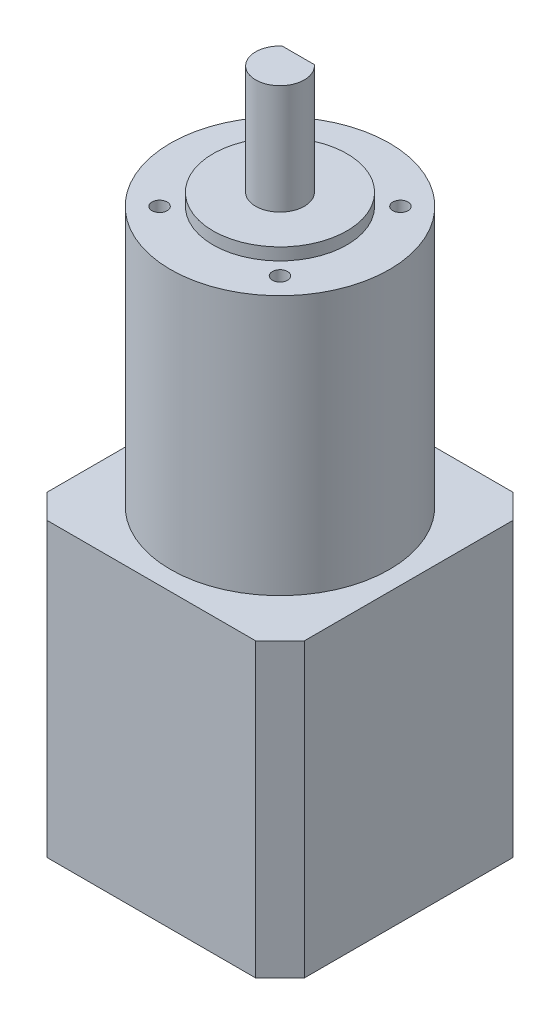
ISO-10303-21;
HEADER;
FILE_DESCRIPTION(('STEP AP214'),'2;1');
FILE_NAME('part.step','',(''),(''),'','','');
FILE_SCHEMA(('AUTOMOTIVE_DESIGN { 1 0 10303 214 1 1 1 1 }'));
ENDSEC;
DATA;
#1=APPLICATION_CONTEXT('core data for automotive mechanical design processes');
#2=APPLICATION_PROTOCOL_DEFINITION('international standard','automotive_design',2000,#1);
#3=PRODUCT_CONTEXT('',#1,'mechanical');
#4=PRODUCT('Part','Part','',(#3));
#5=PRODUCT_RELATED_PRODUCT_CATEGORY('part','',(#4));
#6=PRODUCT_DEFINITION_FORMATION('','',#4);
#7=PRODUCT_DEFINITION_CONTEXT('part definition',#1,'design');
#8=PRODUCT_DEFINITION('design','',#6,#7);
#9=PRODUCT_DEFINITION_SHAPE('','',#8);
#10=(LENGTH_UNIT() NAMED_UNIT(*) SI_UNIT(.MILLI.,.METRE.));
#11=(NAMED_UNIT(*) PLANE_ANGLE_UNIT() SI_UNIT($,.RADIAN.));
#12=(NAMED_UNIT(*) SI_UNIT($,.STERADIAN.) SOLID_ANGLE_UNIT());
#13=UNCERTAINTY_MEASURE_WITH_UNIT(LENGTH_MEASURE(1.E-05),#10,'distance_accuracy_value','');
#14=(GEOMETRIC_REPRESENTATION_CONTEXT(3) GLOBAL_UNCERTAINTY_ASSIGNED_CONTEXT((#13)) GLOBAL_UNIT_ASSIGNED_CONTEXT((#10,
#11,#12)) REPRESENTATION_CONTEXT('',''));
#15=CARTESIAN_POINT('',(0.,0.,0.));
#16=DIRECTION('',(0.,0.,1.));
#17=DIRECTION('',(1.,0.,0.));
#18=AXIS2_PLACEMENT_3D('',#15,#16,#17);
#19=CARTESIAN_POINT('',(-21.15,-48.,-21.15));
#20=DIRECTION('',(-1.,0.,0.));
#21=DIRECTION('',(0.,0.,1.));
#22=AXIS2_PLACEMENT_3D('',#19,#20,#21);
#23=PLANE('',#22);
#24=DIRECTION('',(0.,0.,1.));
#25=VECTOR('',#24,1.);
#26=CARTESIAN_POINT('',(-21.15,0.,-21.15));
#27=LINE('',#26,#25);
#28=CARTESIAN_POINT('',(-21.15,0.,-17.15));
#29=VERTEX_POINT('',#28);
#30=CARTESIAN_POINT('',(-21.15,0.,17.15));
#31=VERTEX_POINT('',#30);
#32=EDGE_CURVE('E208',#29,#31,#27,.T.);
#33=ORIENTED_EDGE('',*,*,#32,.F.);
#34=DIRECTION('',(0.,-1.,0.));
#35=VECTOR('',#34,1.);
#36=CARTESIAN_POINT('',(-21.15,-48.,-17.15));
#37=LINE('',#36,#35);
#38=CARTESIAN_POINT('',(-21.15,-48.,-17.15));
#39=VERTEX_POINT('',#38);
#40=EDGE_CURVE('E284',#29,#39,#37,.T.);
#41=ORIENTED_EDGE('',*,*,#40,.T.);
#42=DIRECTION('',(0.,0.,1.));
#43=VECTOR('',#42,1.);
#44=CARTESIAN_POINT('',(-21.15,-48.,-21.15));
#45=LINE('',#44,#43);
#46=CARTESIAN_POINT('',(-21.15,-48.,17.15));
#47=VERTEX_POINT('',#46);
#48=EDGE_CURVE('E213',#39,#47,#45,.T.);
#49=ORIENTED_EDGE('',*,*,#48,.T.);
#50=DIRECTION('',(0.,1.,0.));
#51=VECTOR('',#50,1.);
#52=CARTESIAN_POINT('',(-21.15,-48.,17.15));
#53=LINE('',#52,#51);
#54=EDGE_CURVE('E280',#47,#31,#53,.T.);
#55=ORIENTED_EDGE('',*,*,#54,.T.);
#56=EDGE_LOOP('',(#33,#41,#49,#55));
#57=FACE_BOUND('',#56,.T.);
#58=ADVANCED_FACE('F43',(#57),#23,.T.);
#59=CARTESIAN_POINT('',(-21.15,-48.,-21.15));
#60=DIRECTION('',(0.,0.,-1.));
#61=DIRECTION('',(-1.,0.,0.));
#62=AXIS2_PLACEMENT_3D('',#59,#60,#61);
#63=PLANE('',#62);
#64=DIRECTION('',(-1.,0.,0.));
#65=VECTOR('',#64,1.);
#66=CARTESIAN_POINT('',(-21.15,0.,-21.15));
#67=LINE('',#66,#65);
#68=CARTESIAN_POINT('',(17.15,0.,-21.15));
#69=VERTEX_POINT('',#68);
#70=CARTESIAN_POINT('',(-17.15,0.,-21.15));
#71=VERTEX_POINT('',#70);
#72=EDGE_CURVE('E218',#69,#71,#67,.T.);
#73=ORIENTED_EDGE('',*,*,#72,.F.);
#74=DIRECTION('',(0.,-1.,0.));
#75=VECTOR('',#74,1.);
#76=CARTESIAN_POINT('',(17.15,-48.,-21.15));
#77=LINE('',#76,#75);
#78=CARTESIAN_POINT('',(17.15,-48.,-21.15));
#79=VERTEX_POINT('',#78);
#80=EDGE_CURVE('E266',#69,#79,#77,.T.);
#81=ORIENTED_EDGE('',*,*,#80,.T.);
#82=DIRECTION('',(-1.,0.,0.));
#83=VECTOR('',#82,1.);
#84=CARTESIAN_POINT('',(-21.15,-48.,-21.15));
#85=LINE('',#84,#83);
#86=CARTESIAN_POINT('',(-17.15,-48.,-21.15));
#87=VERTEX_POINT('',#86);
#88=EDGE_CURVE('E225',#79,#87,#85,.T.);
#89=ORIENTED_EDGE('',*,*,#88,.T.);
#90=DIRECTION('',(0.,1.,0.));
#91=VECTOR('',#90,1.);
#92=CARTESIAN_POINT('',(-17.15,-48.,-21.15));
#93=LINE('',#92,#91);
#94=EDGE_CURVE('E262',#87,#71,#93,.T.);
#95=ORIENTED_EDGE('',*,*,#94,.T.);
#96=EDGE_LOOP('',(#73,#81,#89,#95));
#97=FACE_BOUND('',#96,.T.);
#98=ADVANCED_FACE('F314',(#97),#63,.T.);
#99=CARTESIAN_POINT('',(21.15,-48.,-21.15));
#100=DIRECTION('',(1.,0.,0.));
#101=DIRECTION('',(0.,0.,-1.));
#102=AXIS2_PLACEMENT_3D('',#99,#100,#101);
#103=PLANE('',#102);
#104=DIRECTION('',(0.,0.,-1.));
#105=VECTOR('',#104,1.);
#106=CARTESIAN_POINT('',(21.15,-48.,-21.15));
#107=LINE('',#106,#105);
#108=CARTESIAN_POINT('',(21.15,-48.,17.15));
#109=VERTEX_POINT('',#108);
#110=CARTESIAN_POINT('',(21.15,-48.,-17.15));
#111=VERTEX_POINT('',#110);
#112=EDGE_CURVE('E221',#109,#111,#107,.T.);
#113=ORIENTED_EDGE('',*,*,#112,.T.);
#114=DIRECTION('',(0.,1.,0.));
#115=VECTOR('',#114,1.);
#116=CARTESIAN_POINT('',(21.15,-48.,-17.15));
#117=LINE('',#116,#115);
#118=CARTESIAN_POINT('',(21.15,0.,-17.15));
#119=VERTEX_POINT('',#118);
#120=EDGE_CURVE('E246',#111,#119,#117,.T.);
#121=ORIENTED_EDGE('',*,*,#120,.T.);
#122=DIRECTION('',(0.,0.,-1.));
#123=VECTOR('',#122,1.);
#124=CARTESIAN_POINT('',(21.15,0.,-21.15));
#125=LINE('',#124,#123);
#126=CARTESIAN_POINT('',(21.15,0.,17.15));
#127=VERTEX_POINT('',#126);
#128=EDGE_CURVE('E237',#127,#119,#125,.T.);
#129=ORIENTED_EDGE('',*,*,#128,.F.);
#130=DIRECTION('',(0.,-1.,0.));
#131=VECTOR('',#130,1.);
#132=CARTESIAN_POINT('',(21.15,-48.,17.15));
#133=LINE('',#132,#131);
#134=EDGE_CURVE('E229',#127,#109,#133,.T.);
#135=ORIENTED_EDGE('',*,*,#134,.T.);
#136=EDGE_LOOP('',(#113,#121,#129,#135));
#137=FACE_BOUND('',#136,.T.);
#138=ADVANCED_FACE('F322',(#137),#103,.T.);
#139=CARTESIAN_POINT('',(-21.15,-48.,21.15));
#140=DIRECTION('',(0.,0.,1.));
#141=DIRECTION('',(1.,0.,0.));
#142=AXIS2_PLACEMENT_3D('',#139,#140,#141);
#143=PLANE('',#142);
#144=DIRECTION('',(1.,0.,0.));
#145=VECTOR('',#144,1.);
#146=CARTESIAN_POINT('',(-21.15,0.,21.15));
#147=LINE('',#146,#145);
#148=CARTESIAN_POINT('',(-17.15,0.,21.15));
#149=VERTEX_POINT('',#148);
#150=CARTESIAN_POINT('',(17.15,0.,21.15));
#151=VERTEX_POINT('',#150);
#152=EDGE_CURVE('E233',#149,#151,#147,.T.);
#153=ORIENTED_EDGE('',*,*,#152,.F.);
#154=DIRECTION('',(0.,-1.,0.));
#155=VECTOR('',#154,1.);
#156=CARTESIAN_POINT('',(-17.15,-48.,21.15));
#157=LINE('',#156,#155);
#158=CARTESIAN_POINT('',(-17.15,-48.,21.15));
#159=VERTEX_POINT('',#158);
#160=EDGE_CURVE('E212',#149,#159,#157,.T.);
#161=ORIENTED_EDGE('',*,*,#160,.T.);
#162=DIRECTION('',(1.,0.,0.));
#163=VECTOR('',#162,1.);
#164=CARTESIAN_POINT('',(-21.15,-48.,21.15));
#165=LINE('',#164,#163);
#166=CARTESIAN_POINT('',(17.15,-48.,21.15));
#167=VERTEX_POINT('',#166);
#168=EDGE_CURVE('E217',#159,#167,#165,.T.);
#169=ORIENTED_EDGE('',*,*,#168,.T.);
#170=DIRECTION('',(0.,1.,0.));
#171=VECTOR('',#170,1.);
#172=CARTESIAN_POINT('',(17.15,-48.,21.15));
#173=LINE('',#172,#171);
#174=EDGE_CURVE('E287',#167,#151,#173,.T.);
#175=ORIENTED_EDGE('',*,*,#174,.T.);
#176=EDGE_LOOP('',(#153,#161,#169,#175));
#177=FACE_BOUND('',#176,.T.);
#178=ADVANCED_FACE('F294',(#177),#143,.T.);
#179=CARTESIAN_POINT('',(0.,-48.,0.));
#180=DIRECTION('',(0.,1.,0.));
#181=DIRECTION('',(0.,0.,1.));
#182=AXIS2_PLACEMENT_3D('',#179,#180,#181);
#183=PLANE('',#182);
#184=ORIENTED_EDGE('',*,*,#88,.F.);
#185=DIRECTION('',(-0.707106781186549,0.,-0.707106781186546));
#186=VECTOR('',#185,1.);
#187=CARTESIAN_POINT('',(21.15,-48.,-17.15));
#188=LINE('',#187,#186);
#189=EDGE_CURVE('E277',#79,#111,#188,.F.);
#190=ORIENTED_EDGE('',*,*,#189,.T.);
#191=ORIENTED_EDGE('',*,*,#112,.F.);
#192=DIRECTION('',(0.707106781186546,0.,-0.707106781186549));
#193=VECTOR('',#192,1.);
#194=CARTESIAN_POINT('',(17.15,-48.,21.15));
#195=LINE('',#194,#193);
#196=EDGE_CURVE('E68',#109,#167,#195,.F.);
#197=ORIENTED_EDGE('',*,*,#196,.T.);
#198=ORIENTED_EDGE('',*,*,#168,.F.);
#199=DIRECTION('',(0.707106781186549,0.,0.707106781186546));
#200=VECTOR('',#199,1.);
#201=CARTESIAN_POINT('',(-21.15,-48.,17.15));
#202=LINE('',#201,#200);
#203=EDGE_CURVE('E271',#159,#47,#202,.F.);
#204=ORIENTED_EDGE('',*,*,#203,.T.);
#205=ORIENTED_EDGE('',*,*,#48,.F.);
#206=DIRECTION('',(-0.707106781186546,0.,0.707106781186549));
#207=VECTOR('',#206,1.);
#208=CARTESIAN_POINT('',(-17.15,-48.,-21.15));
#209=LINE('',#208,#207);
#210=EDGE_CURVE('E274',#39,#87,#209,.F.);
#211=ORIENTED_EDGE('',*,*,#210,.T.);
#212=EDGE_LOOP('',(#184,#190,#191,#197,#198,#204,#205,#211));
#213=FACE_BOUND('',#212,.T.);
#214=ADVANCED_FACE('F299',(#213),#183,.F.);
#215=CARTESIAN_POINT('',(0.,0.,0.));
#216=DIRECTION('',(0.,1.,0.));
#217=DIRECTION('',(0.,0.,1.));
#218=AXIS2_PLACEMENT_3D('',#215,#216,#217);
#219=PLANE('',#218);
#220=CARTESIAN_POINT('',(0.,0.,0.));
#221=DIRECTION('',(0.,1.,0.));
#222=DIRECTION('',(0.,0.,1.));
#223=AXIS2_PLACEMENT_3D('',#220,#221,#222);
#224=CIRCLE('',#223,18.);
#225=CARTESIAN_POINT('',(0.,0.,-18.));
#226=VERTEX_POINT('',#225);
#227=EDGE_CURVE('E204',#226,#226,#224,.T.);
#228=ORIENTED_EDGE('',*,*,#227,.F.);
#229=EDGE_LOOP('',(#228));
#230=FACE_BOUND('',#229,.T.);
#231=ORIENTED_EDGE('',*,*,#128,.T.);
#232=DIRECTION('',(0.707106781186549,0.,0.707106781186546));
#233=VECTOR('',#232,1.);
#234=CARTESIAN_POINT('',(19.15,0.,-19.15));
#235=LINE('',#234,#233);
#236=EDGE_CURVE('E259',#119,#69,#235,.F.);
#237=ORIENTED_EDGE('',*,*,#236,.T.);
#238=ORIENTED_EDGE('',*,*,#72,.T.);
#239=DIRECTION('',(0.707106781186546,0.,-0.707106781186549));
#240=VECTOR('',#239,1.);
#241=CARTESIAN_POINT('',(-19.15,0.,-19.15));
#242=LINE('',#241,#240);
#243=EDGE_CURVE('E256',#71,#29,#242,.F.);
#244=ORIENTED_EDGE('',*,*,#243,.T.);
#245=ORIENTED_EDGE('',*,*,#32,.T.);
#246=DIRECTION('',(-0.707106781186549,0.,-0.707106781186546));
#247=VECTOR('',#246,1.);
#248=CARTESIAN_POINT('',(-19.15,0.,19.15));
#249=LINE('',#248,#247);
#250=EDGE_CURVE('E253',#31,#149,#249,.F.);
#251=ORIENTED_EDGE('',*,*,#250,.T.);
#252=ORIENTED_EDGE('',*,*,#152,.T.);
#253=DIRECTION('',(-0.707106781186546,0.,0.707106781186549));
#254=VECTOR('',#253,1.);
#255=CARTESIAN_POINT('',(19.15,0.,19.15));
#256=LINE('',#255,#254);
#257=EDGE_CURVE('E250',#151,#127,#256,.F.);
#258=ORIENTED_EDGE('',*,*,#257,.T.);
#259=EDGE_LOOP('',(#231,#237,#238,#244,#245,#251,#252,#258));
#260=FACE_BOUND('',#259,.T.);
#261=ADVANCED_FACE('F307',(#230,#260),#219,.T.);
#262=CARTESIAN_POINT('',(21.15,-48.,-17.15));
#263=DIRECTION('',(-0.707106781186546,0.,0.707106781186549));
#264=DIRECTION('',(0.,1.,0.));
#265=AXIS2_PLACEMENT_3D('',#262,#263,#264);
#266=PLANE('',#265);
#267=ORIENTED_EDGE('',*,*,#189,.F.);
#268=ORIENTED_EDGE('',*,*,#80,.F.);
#269=ORIENTED_EDGE('',*,*,#236,.F.);
#270=ORIENTED_EDGE('',*,*,#120,.F.);
#271=EDGE_LOOP('',(#267,#268,#269,#270));
#272=FACE_BOUND('',#271,.T.);
#273=ADVANCED_FACE('F319',(#272),#266,.F.);
#274=CARTESIAN_POINT('',(-17.15,-48.,-21.15));
#275=DIRECTION('',(0.707106781186549,0.,0.707106781186546));
#276=DIRECTION('',(0.,1.,0.));
#277=AXIS2_PLACEMENT_3D('',#274,#275,#276);
#278=PLANE('',#277);
#279=ORIENTED_EDGE('',*,*,#210,.F.);
#280=ORIENTED_EDGE('',*,*,#40,.F.);
#281=ORIENTED_EDGE('',*,*,#243,.F.);
#282=ORIENTED_EDGE('',*,*,#94,.F.);
#283=EDGE_LOOP('',(#279,#280,#281,#282));
#284=FACE_BOUND('',#283,.T.);
#285=ADVANCED_FACE('F312',(#284),#278,.F.);
#286=CARTESIAN_POINT('',(-21.15,-48.,17.15));
#287=DIRECTION('',(0.707106781186546,0.,-0.707106781186549));
#288=DIRECTION('',(0.,1.,0.));
#289=AXIS2_PLACEMENT_3D('',#286,#287,#288);
#290=PLANE('',#289);
#291=ORIENTED_EDGE('',*,*,#203,.F.);
#292=ORIENTED_EDGE('',*,*,#160,.F.);
#293=ORIENTED_EDGE('',*,*,#250,.F.);
#294=ORIENTED_EDGE('',*,*,#54,.F.);
#295=EDGE_LOOP('',(#291,#292,#293,#294));
#296=FACE_BOUND('',#295,.T.);
#297=ADVANCED_FACE('F302',(#296),#290,.F.);
#298=CARTESIAN_POINT('',(17.15,-48.,21.15));
#299=DIRECTION('',(-0.707106781186549,0.,-0.707106781186546));
#300=DIRECTION('',(0.,1.,0.));
#301=AXIS2_PLACEMENT_3D('',#298,#299,#300);
#302=PLANE('',#301);
#303=ORIENTED_EDGE('',*,*,#196,.F.);
#304=ORIENTED_EDGE('',*,*,#134,.F.);
#305=ORIENTED_EDGE('',*,*,#257,.F.);
#306=ORIENTED_EDGE('',*,*,#174,.F.);
#307=EDGE_LOOP('',(#303,#304,#305,#306));
#308=FACE_BOUND('',#307,.T.);
#309=ADVANCED_FACE('F46',(#308),#302,.F.);
#310=CARTESIAN_POINT('',(0.,42.7,0.));
#311=DIRECTION('',(0.,-1.,0.));
#312=DIRECTION('',(0.,0.,-1.));
#313=AXIS2_PLACEMENT_3D('',#310,#311,#312);
#314=CYLINDRICAL_SURFACE('',#313,18.);
#315=CARTESIAN_POINT('',(0.,42.7,0.));
#316=DIRECTION('',(0.,1.,0.));
#317=DIRECTION('',(0.,0.,1.));
#318=AXIS2_PLACEMENT_3D('',#315,#316,#317);
#319=CIRCLE('',#318,18.);
#320=CARTESIAN_POINT('',(0.,42.7,-18.));
#321=VERTEX_POINT('',#320);
#322=EDGE_CURVE('E200',#321,#321,#319,.T.);
#323=CARTESIAN_POINT('',(0.,42.7,-18.));
#324=CARTESIAN_POINT('',(0.,42.2552083333333,-18.));
#325=CARTESIAN_POINT('',(0.,41.8104166666667,-18.));
#326=CARTESIAN_POINT('',(0.,40.9208333333333,-18.));
#327=CARTESIAN_POINT('',(0.,40.4760416666667,-18.));
#328=CARTESIAN_POINT('',(0.,39.5864583333333,-18.));
#329=CARTESIAN_POINT('',(0.,39.1416666666667,-18.));
#330=CARTESIAN_POINT('',(0.,38.2520833333333,-18.));
#331=CARTESIAN_POINT('',(0.,37.8072916666667,-18.));
#332=CARTESIAN_POINT('',(0.,36.9177083333333,-18.));
#333=CARTESIAN_POINT('',(0.,36.4729166666667,-18.));
#334=CARTESIAN_POINT('',(0.,35.5833333333333,-18.));
#335=CARTESIAN_POINT('',(0.,35.1385416666667,-18.));
#336=CARTESIAN_POINT('',(0.,34.2489583333333,-18.));
#337=CARTESIAN_POINT('',(0.,33.8041666666667,-18.));
#338=CARTESIAN_POINT('',(0.,32.9145833333333,-18.));
#339=CARTESIAN_POINT('',(0.,32.4697916666667,-18.));
#340=CARTESIAN_POINT('',(0.,31.5802083333333,-18.));
#341=CARTESIAN_POINT('',(0.,31.1354166666667,-18.));
#342=CARTESIAN_POINT('',(0.,30.2458333333333,-18.));
#343=CARTESIAN_POINT('',(0.,29.8010416666667,-18.));
#344=CARTESIAN_POINT('',(0.,28.9114583333333,-18.));
#345=CARTESIAN_POINT('',(0.,28.4666666666667,-18.));
#346=CARTESIAN_POINT('',(0.,27.5770833333333,-18.));
#347=CARTESIAN_POINT('',(0.,27.1322916666667,-18.));
#348=CARTESIAN_POINT('',(0.,26.2427083333333,-18.));
#349=CARTESIAN_POINT('',(0.,25.7979166666667,-18.));
#350=CARTESIAN_POINT('',(0.,24.9083333333333,-18.));
#351=CARTESIAN_POINT('',(0.,24.4635416666667,-18.));
#352=CARTESIAN_POINT('',(0.,23.5739583333333,-18.));
#353=CARTESIAN_POINT('',(0.,23.1291666666667,-18.));
#354=CARTESIAN_POINT('',(0.,22.2395833333333,-18.));
#355=CARTESIAN_POINT('',(0.,21.7947916666667,-18.));
#356=CARTESIAN_POINT('',(0.,20.9052083333333,-18.));
#357=CARTESIAN_POINT('',(0.,20.4604166666667,-18.));
#358=CARTESIAN_POINT('',(0.,19.5708333333333,-18.));
#359=CARTESIAN_POINT('',(0.,19.1260416666667,-18.));
#360=CARTESIAN_POINT('',(0.,18.2364583333333,-18.));
#361=CARTESIAN_POINT('',(0.,17.7916666666667,-18.));
#362=CARTESIAN_POINT('',(0.,16.9020833333333,-18.));
#363=CARTESIAN_POINT('',(0.,16.4572916666667,-18.));
#364=CARTESIAN_POINT('',(0.,15.5677083333333,-18.));
#365=CARTESIAN_POINT('',(0.,15.1229166666667,-18.));
#366=CARTESIAN_POINT('',(0.,14.2333333333333,-18.));
#367=CARTESIAN_POINT('',(0.,13.7885416666667,-18.));
#368=CARTESIAN_POINT('',(0.,12.8989583333333,-18.));
#369=CARTESIAN_POINT('',(0.,12.4541666666667,-18.));
#370=CARTESIAN_POINT('',(0.,11.5645833333333,-18.));
#371=CARTESIAN_POINT('',(0.,11.1197916666667,-18.));
#372=CARTESIAN_POINT('',(0.,10.2302083333333,-18.));
#373=CARTESIAN_POINT('',(0.,9.78541666666666,-18.));
#374=CARTESIAN_POINT('',(0.,8.89583333333333,-18.));
#375=CARTESIAN_POINT('',(0.,8.45104166666667,-18.));
#376=CARTESIAN_POINT('',(0.,7.56145833333333,-18.));
#377=CARTESIAN_POINT('',(0.,7.11666666666666,-18.));
#378=CARTESIAN_POINT('',(0.,6.22708333333333,-18.));
#379=CARTESIAN_POINT('',(0.,5.78229166666666,-18.));
#380=CARTESIAN_POINT('',(0.,4.89270833333333,-18.));
#381=CARTESIAN_POINT('',(0.,4.44791666666666,-18.));
#382=CARTESIAN_POINT('',(0.,3.55833333333333,-18.));
#383=CARTESIAN_POINT('',(0.,3.11354166666666,-18.));
#384=CARTESIAN_POINT('',(0.,2.22395833333332,-18.));
#385=CARTESIAN_POINT('',(0.,1.77916666666666,-18.));
#386=CARTESIAN_POINT('',(0.,0.889583333333326,-18.));
#387=CARTESIAN_POINT('',(0.,0.444791666666659,-18.));
#388=CARTESIAN_POINT('',(0.,0.,-18.));
#389=B_SPLINE_CURVE_WITH_KNOTS('',3,(#323,#324,#325,#326,#327,#328,#329,#330,#331,#332,#333,
#334,#335,#336,#337,#338,#339,#340,#341,#342,#343,#344,#345,#346,#347,#348,#349,#350,#351,#352,
#353,#354,#355,#356,#357,#358,#359,#360,#361,#362,#363,#364,#365,#366,#367,#368,#369,#370,#371,
#372,#373,#374,#375,#376,#377,#378,#379,#380,#381,#382,#383,#384,#385,#386,#387,#388),
.UNSPECIFIED.,.F.,.F.,(4,2,2,2,2,2,2,2,2,2,2,2,2,2,2,2,2,2,2,2,2,2,2,2,2,2,2,2,2,2,2,2,4),(0.,
1.33437500000001,2.66875,4.003125,5.3375,6.67187500000001,8.00625000000001,9.340625,10.675,
12.009375,13.34375,14.678125,16.0125,17.346875,18.68125,20.015625,21.35,22.684375,24.01875,
25.353125,26.6875,28.021875,29.35625,30.690625,32.025,33.359375,34.69375,36.028125,37.3625,
38.696875,40.03125,41.365625,42.7),.UNSPECIFIED.);
#390=EDGE_CURVE('BSEAM326',#321,#226,#389,.T.);
#391=ORIENTED_EDGE('',*,*,#322,.F.);
#392=ORIENTED_EDGE('',*,*,#227,.T.);
#393=ORIENTED_EDGE('',*,*,#390,.T.);
#394=ORIENTED_EDGE('',*,*,#390,.F.);
#395=EDGE_LOOP('',(#391,#393,#392,#394));
#396=FACE_BOUND('',#395,.T.);
#397=ADVANCED_FACE('F326',(#396),#314,.T.);
#398=CARTESIAN_POINT('',(0.,42.7,0.));
#399=DIRECTION('',(0.,1.,0.));
#400=DIRECTION('',(0.,0.,1.));
#401=AXIS2_PLACEMENT_3D('',#398,#399,#400);
#402=PLANE('',#401);
#403=CARTESIAN_POINT('',(9.89949493661168,42.7,-9.89949493661165));
#404=DIRECTION('',(0.,1.,0.));
#405=DIRECTION('',(-1.,0.,0.));
#406=AXIS2_PLACEMENT_3D('',#403,#404,#405);
#407=CIRCLE('',#406,1.25);
#408=CARTESIAN_POINT('',(8.64949493661168,42.7,-9.89949493661165));
#409=VERTEX_POINT('',#408);
#410=EDGE_CURVE('E146',#409,#409,#407,.T.);
#411=ORIENTED_EDGE('',*,*,#410,.F.);
#412=EDGE_LOOP('',(#411));
#413=FACE_BOUND('',#412,.T.);
#414=CARTESIAN_POINT('',(9.89949493661168,42.7,9.89949493661165));
#415=DIRECTION('',(0.,1.,0.));
#416=DIRECTION('',(0.,0.,-1.));
#417=AXIS2_PLACEMENT_3D('',#414,#415,#416);
#418=CIRCLE('',#417,1.25);
#419=CARTESIAN_POINT('',(9.89949493661168,42.7,8.64949493661165));
#420=VERTEX_POINT('',#419);
#421=EDGE_CURVE('E157',#420,#420,#418,.T.);
#422=ORIENTED_EDGE('',*,*,#421,.F.);
#423=EDGE_LOOP('',(#422));
#424=FACE_BOUND('',#423,.T.);
#425=CARTESIAN_POINT('',(-9.89949493661175,42.7,9.89949493661158));
#426=DIRECTION('',(0.,1.,0.));
#427=DIRECTION('',(1.,0.,0.));
#428=AXIS2_PLACEMENT_3D('',#425,#426,#427);
#429=CIRCLE('',#428,1.25);
#430=CARTESIAN_POINT('',(-8.64949493661175,42.7,9.89949493661159));
#431=VERTEX_POINT('',#430);
#432=EDGE_CURVE('E165',#431,#431,#429,.T.);
#433=ORIENTED_EDGE('',*,*,#432,.F.);
#434=EDGE_LOOP('',(#433));
#435=FACE_BOUND('',#434,.T.);
#436=CARTESIAN_POINT('',(-9.89949493661168,42.7,-9.89949493661165));
#437=DIRECTION('',(0.,1.,0.));
#438=DIRECTION('',(0.,0.,1.));
#439=AXIS2_PLACEMENT_3D('',#436,#437,#438);
#440=CIRCLE('',#439,1.25);
#441=CARTESIAN_POINT('',(-9.89949493661168,42.7,-8.64949493661165));
#442=VERTEX_POINT('',#441);
#443=EDGE_CURVE('E145',#442,#442,#440,.T.);
#444=ORIENTED_EDGE('',*,*,#443,.F.);
#445=EDGE_LOOP('',(#444));
#446=FACE_BOUND('',#445,.T.);
#447=CARTESIAN_POINT('',(0.,42.7,0.));
#448=DIRECTION('',(0.,1.,0.));
#449=DIRECTION('',(0.,0.,1.));
#450=AXIS2_PLACEMENT_3D('',#447,#448,#449);
#451=CIRCLE('',#450,11.);
#452=CARTESIAN_POINT('',(0.,42.7,11.));
#453=VERTEX_POINT('',#452);
#454=EDGE_CURVE('E196',#453,#453,#451,.T.);
#455=ORIENTED_EDGE('',*,*,#454,.F.);
#456=EDGE_LOOP('',(#455));
#457=FACE_BOUND('',#456,.T.);
#458=ORIENTED_EDGE('',*,*,#322,.T.);
#459=EDGE_LOOP('',(#458));
#460=FACE_BOUND('',#459,.T.);
#461=ADVANCED_FACE('F331',(#413,#424,#435,#446,#457,#460),#402,.T.);
#462=CARTESIAN_POINT('',(0.,44.7,0.));
#463=DIRECTION('',(0.,-1.,0.));
#464=DIRECTION('',(0.,0.,-1.));
#465=AXIS2_PLACEMENT_3D('',#462,#463,#464);
#466=CYLINDRICAL_SURFACE('',#465,11.);
#467=CARTESIAN_POINT('',(0.,44.7,0.));
#468=DIRECTION('',(0.,1.,0.));
#469=DIRECTION('',(0.,0.,1.));
#470=AXIS2_PLACEMENT_3D('',#467,#468,#469);
#471=CIRCLE('',#470,11.);
#472=CARTESIAN_POINT('',(0.,44.7,11.));
#473=VERTEX_POINT('',#472);
#474=EDGE_CURVE('E192',#473,#473,#471,.T.);
#475=ORIENTED_EDGE('',*,*,#474,.F.);
#476=EDGE_LOOP('',(#475));
#477=FACE_BOUND('',#476,.T.);
#478=ORIENTED_EDGE('',*,*,#454,.T.);
#479=EDGE_LOOP('',(#478));
#480=FACE_BOUND('',#479,.T.);
#481=ADVANCED_FACE('F522',(#477,#480),#466,.T.);
#482=CARTESIAN_POINT('',(0.,44.7,0.));
#483=DIRECTION('',(0.,1.,0.));
#484=DIRECTION('',(0.,0.,1.));
#485=AXIS2_PLACEMENT_3D('',#482,#483,#484);
#486=PLANE('',#485);
#487=CARTESIAN_POINT('',(0.,44.7,0.));
#488=DIRECTION('',(0.,1.,0.));
#489=DIRECTION('',(0.,0.,1.));
#490=AXIS2_PLACEMENT_3D('',#487,#488,#489);
#491=CIRCLE('',#490,4.);
#492=CARTESIAN_POINT('',(0.,44.7,4.));
#493=VERTEX_POINT('',#492);
#494=EDGE_CURVE('E53',#493,#493,#491,.T.);
#495=ORIENTED_EDGE('',*,*,#494,.F.);
#496=EDGE_LOOP('',(#495));
#497=FACE_BOUND('',#496,.T.);
#498=ORIENTED_EDGE('',*,*,#474,.T.);
#499=EDGE_LOOP('',(#498));
#500=FACE_BOUND('',#499,.T.);
#501=ADVANCED_FACE('F401',(#497,#500),#486,.T.);
#502=CARTESIAN_POINT('',(0.,62.7,0.));
#503=DIRECTION('',(0.,-1.,0.));
#504=DIRECTION('',(0.,0.,-1.));
#505=AXIS2_PLACEMENT_3D('',#502,#503,#504);
#506=CYLINDRICAL_SURFACE('',#505,4.);
#507=CARTESIAN_POINT('',(0.,62.7,0.));
#508=DIRECTION('',(0.,1.,0.));
#509=DIRECTION('',(0.,0.,1.));
#510=AXIS2_PLACEMENT_3D('',#507,#508,#509);
#511=CIRCLE('',#510,4.);
#512=CARTESIAN_POINT('',(-2.64575131106459,62.7,-3.));
#513=VERTEX_POINT('',#512);
#514=CARTESIAN_POINT('',(2.64575131106459,62.7,-3.));
#515=VERTEX_POINT('',#514);
#516=EDGE_CURVE('E186',#513,#515,#511,.T.);
#517=ORIENTED_EDGE('',*,*,#516,.F.);
#518=DIRECTION('',(0.,1.,0.));
#519=VECTOR('',#518,1.);
#520=CARTESIAN_POINT('',(-2.64575131106459,47.7,-3.));
#521=LINE('',#520,#519);
#522=CARTESIAN_POINT('',(-2.64575131106459,47.7,-3.));
#523=VERTEX_POINT('',#522);
#524=EDGE_CURVE('E60',#523,#513,#521,.T.);
#525=ORIENTED_EDGE('',*,*,#524,.F.);
#526=CARTESIAN_POINT('',(0.,47.7,0.));
#527=DIRECTION('',(0.,1.,0.));
#528=DIRECTION('',(0.,0.,1.));
#529=AXIS2_PLACEMENT_3D('',#526,#527,#528);
#530=CIRCLE('',#529,4.);
#531=CARTESIAN_POINT('',(2.64575131106459,47.7,-3.));
#532=VERTEX_POINT('',#531);
#533=EDGE_CURVE('E11',#532,#523,#530,.T.);
#534=ORIENTED_EDGE('',*,*,#533,.F.);
#535=DIRECTION('',(0.,1.,0.));
#536=VECTOR('',#535,1.);
#537=CARTESIAN_POINT('',(2.64575131106459,47.7,-3.));
#538=LINE('',#537,#536);
#539=EDGE_CURVE('E182',#532,#515,#538,.T.);
#540=ORIENTED_EDGE('',*,*,#539,.T.);
#541=EDGE_LOOP('',(#517,#525,#534,#540));
#542=FACE_BOUND('',#541,.T.);
#543=ORIENTED_EDGE('',*,*,#494,.T.);
#544=EDGE_LOOP('',(#543));
#545=FACE_BOUND('',#544,.T.);
#546=ADVANCED_FACE('F395',(#542,#545),#506,.T.);
#547=CARTESIAN_POINT('',(0.,62.7,0.));
#548=DIRECTION('',(0.,1.,0.));
#549=DIRECTION('',(0.,0.,1.));
#550=AXIS2_PLACEMENT_3D('',#547,#548,#549);
#551=PLANE('',#550);
#552=DIRECTION('',(1.,0.,0.));
#553=VECTOR('',#552,1.);
#554=CARTESIAN_POINT('',(-2.64575131106459,62.7,-3.));
#555=LINE('',#554,#553);
#556=EDGE_CURVE('E175',#513,#515,#555,.T.);
#557=ORIENTED_EDGE('',*,*,#556,.F.);
#558=ORIENTED_EDGE('',*,*,#516,.T.);
#559=EDGE_LOOP('',(#557,#558));
#560=FACE_BOUND('',#559,.T.);
#561=ADVANCED_FACE('F400',(#560),#551,.T.);
#562=CARTESIAN_POINT('',(0.,47.7,0.));
#563=DIRECTION('',(0.,1.,0.));
#564=DIRECTION('',(0.,0.,1.));
#565=AXIS2_PLACEMENT_3D('',#562,#563,#564);
#566=PLANE('',#565);
#567=DIRECTION('',(1.,0.,0.));
#568=VECTOR('',#567,1.);
#569=CARTESIAN_POINT('',(-2.64575131106459,47.7,-3.));
#570=LINE('',#569,#568);
#571=EDGE_CURVE('E176',#523,#532,#570,.T.);
#572=ORIENTED_EDGE('',*,*,#571,.T.);
#573=ORIENTED_EDGE('',*,*,#533,.T.);
#574=EDGE_LOOP('',(#572,#573));
#575=FACE_BOUND('',#574,.T.);
#576=ADVANCED_FACE('F413',(#575),#566,.T.);
#577=CARTESIAN_POINT('',(-2.64575131106459,47.7,-3.));
#578=DIRECTION('',(0.,0.,1.));
#579=DIRECTION('',(1.,0.,0.));
#580=AXIS2_PLACEMENT_3D('',#577,#578,#579);
#581=PLANE('',#580);
#582=ORIENTED_EDGE('',*,*,#556,.T.);
#583=ORIENTED_EDGE('',*,*,#539,.F.);
#584=ORIENTED_EDGE('',*,*,#571,.F.);
#585=ORIENTED_EDGE('',*,*,#524,.T.);
#586=EDGE_LOOP('',(#582,#583,#584,#585));
#587=FACE_BOUND('',#586,.T.);
#588=ADVANCED_FACE('F423',(#587),#581,.F.);
#589=CARTESIAN_POINT('',(-9.89949493661168,37.7,-9.89949493661165));
#590=DIRECTION('',(0.,1.,0.));
#591=DIRECTION('',(0.,0.,1.));
#592=AXIS2_PLACEMENT_3D('',#589,#590,#591);
#593=CONICAL_SURFACE('',#592,1.25,1.02974425867665);
#594=CARTESIAN_POINT('',(-9.89949493661168,36.9489242262156,-9.89949493661165));
#595=VERTEX_POINT('',#594);
#596=VERTEX_LOOP('',#595);
#597=FACE_BOUND('',#596,.T.);
#598=CARTESIAN_POINT('',(-9.89949493661168,37.7,-9.89949493661165));
#599=DIRECTION('',(0.,1.,0.));
#600=DIRECTION('',(0.,0.,1.));
#601=AXIS2_PLACEMENT_3D('',#598,#599,#600);
#602=CIRCLE('',#601,1.25);
#603=CARTESIAN_POINT('',(-9.89949493661168,37.7,-8.64949493661165));
#604=VERTEX_POINT('',#603);
#605=EDGE_CURVE('E151',#604,#604,#602,.T.);
#606=ORIENTED_EDGE('',*,*,#605,.T.);
#607=EDGE_LOOP('',(#606));
#608=FACE_BOUND('',#607,.T.);
#609=ADVANCED_FACE('F432',(#597,#608),#593,.F.);
#610=CARTESIAN_POINT('',(-9.89949493661168,42.7,-9.89949493661165));
#611=DIRECTION('',(0.,1.,0.));
#612=DIRECTION('',(0.,0.,1.));
#613=AXIS2_PLACEMENT_3D('',#610,#611,#612);
#614=CYLINDRICAL_SURFACE('',#613,1.25);
#615=ORIENTED_EDGE('',*,*,#605,.F.);
#616=EDGE_LOOP('',(#615));
#617=FACE_BOUND('',#616,.T.);
#618=ORIENTED_EDGE('',*,*,#443,.T.);
#619=EDGE_LOOP('',(#618));
#620=FACE_BOUND('',#619,.T.);
#621=ADVANCED_FACE('F441',(#617,#620),#614,.F.);
#622=CARTESIAN_POINT('',(-9.89949493661175,37.7,9.89949493661158));
#623=DIRECTION('',(0.,1.,0.));
#624=DIRECTION('',(1.,0.,0.));
#625=AXIS2_PLACEMENT_3D('',#622,#623,#624);
#626=CONICAL_SURFACE('',#625,1.25,1.02974425867665);
#627=CARTESIAN_POINT('',(-9.89949493661175,36.9489242262156,9.89949493661158));
#628=VERTEX_POINT('',#627);
#629=VERTEX_LOOP('',#628);
#630=FACE_BOUND('',#629,.T.);
#631=CARTESIAN_POINT('',(-9.89949493661175,37.7,9.89949493661158));
#632=DIRECTION('',(0.,1.,0.));
#633=DIRECTION('',(1.,0.,0.));
#634=AXIS2_PLACEMENT_3D('',#631,#632,#633);
#635=CIRCLE('',#634,1.25);
#636=CARTESIAN_POINT('',(-8.64949493661175,37.7,9.89949493661159));
#637=VERTEX_POINT('',#636);
#638=EDGE_CURVE('E161',#637,#637,#635,.T.);
#639=ORIENTED_EDGE('',*,*,#638,.T.);
#640=EDGE_LOOP('',(#639));
#641=FACE_BOUND('',#640,.T.);
#642=ADVANCED_FACE('F449',(#630,#641),#626,.F.);
#643=CARTESIAN_POINT('',(-9.89949493661175,42.7,9.89949493661158));
#644=DIRECTION('',(0.,1.,0.));
#645=DIRECTION('',(1.,0.,0.));
#646=AXIS2_PLACEMENT_3D('',#643,#644,#645);
#647=CYLINDRICAL_SURFACE('',#646,1.25);
#648=ORIENTED_EDGE('',*,*,#638,.F.);
#649=EDGE_LOOP('',(#648));
#650=FACE_BOUND('',#649,.T.);
#651=ORIENTED_EDGE('',*,*,#432,.T.);
#652=EDGE_LOOP('',(#651));
#653=FACE_BOUND('',#652,.T.);
#654=ADVANCED_FACE('F458',(#650,#653),#647,.F.);
#655=CARTESIAN_POINT('',(9.89949493661168,37.7,9.89949493661165));
#656=DIRECTION('',(0.,1.,0.));
#657=DIRECTION('',(0.,0.,-1.));
#658=AXIS2_PLACEMENT_3D('',#655,#656,#657);
#659=CONICAL_SURFACE('',#658,1.25,1.02974425867665);
#660=CARTESIAN_POINT('',(9.89949493661168,36.9489242262156,9.89949493661165));
#661=VERTEX_POINT('',#660);
#662=VERTEX_LOOP('',#661);
#663=FACE_BOUND('',#662,.T.);
#664=CARTESIAN_POINT('',(9.89949493661168,37.7,9.89949493661165));
#665=DIRECTION('',(0.,1.,0.));
#666=DIRECTION('',(0.,0.,-1.));
#667=AXIS2_PLACEMENT_3D('',#664,#665,#666);
#668=CIRCLE('',#667,1.25);
#669=CARTESIAN_POINT('',(9.89949493661168,37.7,8.64949493661165));
#670=VERTEX_POINT('',#669);
#671=EDGE_CURVE('E154',#670,#670,#668,.T.);
#672=ORIENTED_EDGE('',*,*,#671,.T.);
#673=EDGE_LOOP('',(#672));
#674=FACE_BOUND('',#673,.T.);
#675=ADVANCED_FACE('F466',(#663,#674),#659,.F.);
#676=CARTESIAN_POINT('',(9.89949493661168,42.7,9.89949493661165));
#677=DIRECTION('',(0.,1.,0.));
#678=DIRECTION('',(0.,0.,-1.));
#679=AXIS2_PLACEMENT_3D('',#676,#677,#678);
#680=CYLINDRICAL_SURFACE('',#679,1.25);
#681=ORIENTED_EDGE('',*,*,#671,.F.);
#682=EDGE_LOOP('',(#681));
#683=FACE_BOUND('',#682,.T.);
#684=ORIENTED_EDGE('',*,*,#421,.T.);
#685=EDGE_LOOP('',(#684));
#686=FACE_BOUND('',#685,.T.);
#687=ADVANCED_FACE('F138',(#683,#686),#680,.F.);
#688=CARTESIAN_POINT('',(9.89949493661168,37.7,-9.89949493661165));
#689=DIRECTION('',(0.,1.,0.));
#690=DIRECTION('',(-1.,0.,0.));
#691=AXIS2_PLACEMENT_3D('',#688,#689,#690);
#692=CONICAL_SURFACE('',#691,1.25,1.02974425867665);
#693=CARTESIAN_POINT('',(9.89949493661168,36.9489242262156,-9.89949493661165));
#694=VERTEX_POINT('',#693);
#695=VERTEX_LOOP('',#694);
#696=FACE_BOUND('',#695,.T.);
#697=CARTESIAN_POINT('',(9.89949493661168,37.7,-9.89949493661165));
#698=DIRECTION('',(0.,1.,0.));
#699=DIRECTION('',(-1.,0.,0.));
#700=AXIS2_PLACEMENT_3D('',#697,#698,#699);
#701=CIRCLE('',#700,1.25);
#702=CARTESIAN_POINT('',(8.64949493661168,37.7,-9.89949493661165));
#703=VERTEX_POINT('',#702);
#704=EDGE_CURVE('E142',#703,#703,#701,.T.);
#705=ORIENTED_EDGE('',*,*,#704,.T.);
#706=EDGE_LOOP('',(#705));
#707=FACE_BOUND('',#706,.T.);
#708=ADVANCED_FACE('F134',(#696,#707),#692,.F.);
#709=CARTESIAN_POINT('',(9.89949493661168,42.7,-9.89949493661165));
#710=DIRECTION('',(0.,1.,0.));
#711=DIRECTION('',(-1.,0.,0.));
#712=AXIS2_PLACEMENT_3D('',#709,#710,#711);
#713=CYLINDRICAL_SURFACE('',#712,1.25);
#714=ORIENTED_EDGE('',*,*,#704,.F.);
#715=EDGE_LOOP('',(#714));
#716=FACE_BOUND('',#715,.T.);
#717=ORIENTED_EDGE('',*,*,#410,.T.);
#718=EDGE_LOOP('',(#717));
#719=FACE_BOUND('',#718,.T.);
#720=ADVANCED_FACE('F137',(#716,#719),#713,.F.);
#721=CLOSED_SHELL('',(#58,#98,#138,#178,#214,#261,#273,#285,#297,#309,#397,#461,#481,#501,#546,
#561,#576,#588,#609,#621,#642,#654,#675,#687,#708,#720));
#722=MANIFOLD_SOLID_BREP('B2',#721);
#723=ADVANCED_BREP_SHAPE_REPRESENTATION('',(#18,#722),#14);
#724=SHAPE_DEFINITION_REPRESENTATION(#9,#723);
ENDSEC;
END-ISO-10303-21;
